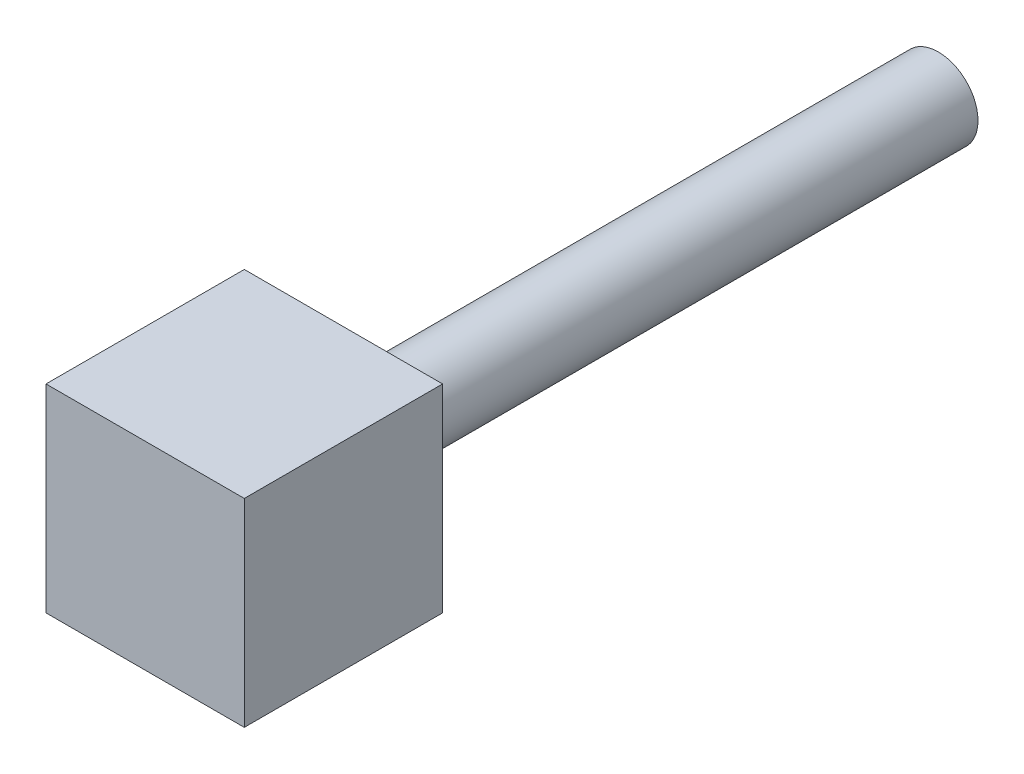
ISO-10303-21;
HEADER;
FILE_DESCRIPTION(('STEP AP214'),'2;1');
FILE_NAME('part.step','',(''),(''),'','','');
FILE_SCHEMA(('AUTOMOTIVE_DESIGN { 1 0 10303 214 1 1 1 1 }'));
ENDSEC;
DATA;
#1=APPLICATION_CONTEXT('core data for automotive mechanical design processes');
#2=APPLICATION_PROTOCOL_DEFINITION('international standard','automotive_design',2000,#1);
#3=PRODUCT_CONTEXT('',#1,'mechanical');
#4=PRODUCT('Part','Part','',(#3));
#5=PRODUCT_RELATED_PRODUCT_CATEGORY('part','',(#4));
#6=PRODUCT_DEFINITION_FORMATION('','',#4);
#7=PRODUCT_DEFINITION_CONTEXT('part definition',#1,'design');
#8=PRODUCT_DEFINITION('design','',#6,#7);
#9=PRODUCT_DEFINITION_SHAPE('','',#8);
#10=(LENGTH_UNIT() NAMED_UNIT(*) SI_UNIT(.MILLI.,.METRE.));
#11=(NAMED_UNIT(*) PLANE_ANGLE_UNIT() SI_UNIT($,.RADIAN.));
#12=(NAMED_UNIT(*) SI_UNIT($,.STERADIAN.) SOLID_ANGLE_UNIT());
#13=UNCERTAINTY_MEASURE_WITH_UNIT(LENGTH_MEASURE(1.E-05),#10,'distance_accuracy_value','');
#14=(GEOMETRIC_REPRESENTATION_CONTEXT(3) GLOBAL_UNCERTAINTY_ASSIGNED_CONTEXT((#13)) GLOBAL_UNIT_ASSIGNED_CONTEXT((#10,
#11,#12)) REPRESENTATION_CONTEXT('',''));
#15=CARTESIAN_POINT('',(0.,0.,0.));
#16=DIRECTION('',(0.,0.,1.));
#17=DIRECTION('',(1.,0.,0.));
#18=AXIS2_PLACEMENT_3D('',#15,#16,#17);
#19=CARTESIAN_POINT('',(0.,1.19607843137255,-14.78460404663));
#20=DIRECTION('',(0.,0.,1.));
#21=DIRECTION('',(1.,0.,0.));
#22=AXIS2_PLACEMENT_3D('',#19,#20,#21);
#23=PLANE('',#22);
#24=CARTESIAN_POINT('',(0.,1.19607843137255,-14.78460404663));
#25=DIRECTION('',(0.,0.,1.));
#26=DIRECTION('',(1.,0.,0.));
#27=AXIS2_PLACEMENT_3D('',#24,#25,#26);
#28=CIRCLE('',#27,4.);
#29=CARTESIAN_POINT('',(4.,1.19607843137255,-14.78460404663));
#30=VERTEX_POINT('',#29);
#31=EDGE_CURVE('E47',#30,#30,#28,.T.);
#32=ORIENTED_EDGE('',*,*,#31,.F.);
#33=EDGE_LOOP('',(#32));
#34=FACE_BOUND('',#33,.T.);
#35=ADVANCED_FACE('F39',(#34),#23,.F.);
#36=CARTESIAN_POINT('',(0.,1.19607843137255,45.21539595337));
#37=DIRECTION('',(0.,0.,1.));
#38=DIRECTION('',(1.,0.,0.));
#39=AXIS2_PLACEMENT_3D('',#36,#37,#38);
#40=CYLINDRICAL_SURFACE('',#39,4.);
#41=CARTESIAN_POINT('',(0.,1.19607843137255,45.21539595337));
#42=DIRECTION('',(0.,0.,1.));
#43=DIRECTION('',(1.,0.,0.));
#44=AXIS2_PLACEMENT_3D('',#41,#42,#43);
#45=CIRCLE('',#44,4.);
#46=CARTESIAN_POINT('',(4.,1.19607843137255,45.21539595337));
#47=VERTEX_POINT('',#46);
#48=EDGE_CURVE('E11',#47,#47,#45,.T.);
#49=ORIENTED_EDGE('',*,*,#48,.F.);
#50=EDGE_LOOP('',(#49));
#51=FACE_BOUND('',#50,.T.);
#52=ORIENTED_EDGE('',*,*,#31,.T.);
#53=EDGE_LOOP('',(#52));
#54=FACE_BOUND('',#53,.T.);
#55=ADVANCED_FACE('F117',(#51,#54),#40,.T.);
#56=CARTESIAN_POINT('',(10.,-8.80392156862745,65.21539595337));
#57=DIRECTION('',(-1.,0.,0.));
#58=DIRECTION('',(0.,-1.,0.));
#59=AXIS2_PLACEMENT_3D('',#56,#57,#58);
#60=PLANE('',#59);
#61=DIRECTION('',(0.,1.,0.));
#62=VECTOR('',#61,1.);
#63=CARTESIAN_POINT('',(10.,-8.80392156862745,45.21539595337));
#64=LINE('',#63,#62);
#65=CARTESIAN_POINT('',(10.,-8.80392156862745,45.21539595337));
#66=VERTEX_POINT('',#65);
#67=CARTESIAN_POINT('',(10.,11.1960784313726,45.21539595337));
#68=VERTEX_POINT('',#67);
#69=EDGE_CURVE('E106',#66,#68,#64,.T.);
#70=ORIENTED_EDGE('',*,*,#69,.T.);
#71=DIRECTION('',(0.,0.,-1.));
#72=VECTOR('',#71,1.);
#73=CARTESIAN_POINT('',(10.,11.1960784313726,65.21539595337));
#74=LINE('',#73,#72);
#75=CARTESIAN_POINT('',(10.,11.1960784313726,65.21539595337));
#76=VERTEX_POINT('',#75);
#77=EDGE_CURVE('E97',#76,#68,#74,.T.);
#78=ORIENTED_EDGE('',*,*,#77,.F.);
#79=DIRECTION('',(0.,1.,0.));
#80=VECTOR('',#79,1.);
#81=CARTESIAN_POINT('',(10.,-8.80392156862745,65.21539595337));
#82=LINE('',#81,#80);
#83=CARTESIAN_POINT('',(10.,-8.80392156862745,65.21539595337));
#84=VERTEX_POINT('',#83);
#85=EDGE_CURVE('E91',#84,#76,#82,.T.);
#86=ORIENTED_EDGE('',*,*,#85,.F.);
#87=DIRECTION('',(0.,0.,-1.));
#88=VECTOR('',#87,1.);
#89=CARTESIAN_POINT('',(10.,-8.80392156862745,65.21539595337));
#90=LINE('',#89,#88);
#91=EDGE_CURVE('E102',#84,#66,#90,.T.);
#92=ORIENTED_EDGE('',*,*,#91,.T.);
#93=EDGE_LOOP('',(#70,#78,#86,#92));
#94=FACE_BOUND('',#93,.T.);
#95=ADVANCED_FACE('F123',(#94),#60,.F.);
#96=CARTESIAN_POINT('',(-10.,11.1960784313726,65.21539595337));
#97=DIRECTION('',(0.,-1.,0.));
#98=DIRECTION('',(0.,0.,-1.));
#99=AXIS2_PLACEMENT_3D('',#96,#97,#98);
#100=PLANE('',#99);
#101=DIRECTION('',(-1.,0.,0.));
#102=VECTOR('',#101,1.);
#103=CARTESIAN_POINT('',(-10.,11.1960784313726,45.21539595337));
#104=LINE('',#103,#102);
#105=CARTESIAN_POINT('',(-10.,11.1960784313726,45.21539595337));
#106=VERTEX_POINT('',#105);
#107=EDGE_CURVE('E96',#68,#106,#104,.T.);
#108=ORIENTED_EDGE('',*,*,#107,.T.);
#109=DIRECTION('',(0.,0.,-1.));
#110=VECTOR('',#109,1.);
#111=CARTESIAN_POINT('',(-10.,11.1960784313726,65.21539595337));
#112=LINE('',#111,#110);
#113=CARTESIAN_POINT('',(-10.,11.1960784313726,65.21539595337));
#114=VERTEX_POINT('',#113);
#115=EDGE_CURVE('E94',#114,#106,#112,.T.);
#116=ORIENTED_EDGE('',*,*,#115,.F.);
#117=DIRECTION('',(-1.,0.,0.));
#118=VECTOR('',#117,1.);
#119=CARTESIAN_POINT('',(-10.,11.1960784313726,65.21539595337));
#120=LINE('',#119,#118);
#121=EDGE_CURVE('E86',#76,#114,#120,.T.);
#122=ORIENTED_EDGE('',*,*,#121,.F.);
#123=ORIENTED_EDGE('',*,*,#77,.T.);
#124=EDGE_LOOP('',(#108,#116,#122,#123));
#125=FACE_BOUND('',#124,.T.);
#126=ADVANCED_FACE('F95',(#125),#100,.F.);
#127=CARTESIAN_POINT('',(-10.,-8.80392156862745,65.21539595337));
#128=DIRECTION('',(1.,0.,0.));
#129=DIRECTION('',(0.,1.,0.));
#130=AXIS2_PLACEMENT_3D('',#127,#128,#129);
#131=PLANE('',#130);
#132=DIRECTION('',(0.,-1.,0.));
#133=VECTOR('',#132,1.);
#134=CARTESIAN_POINT('',(-10.,-8.80392156862745,45.21539595337));
#135=LINE('',#134,#133);
#136=CARTESIAN_POINT('',(-10.,-8.80392156862745,45.21539595337));
#137=VERTEX_POINT('',#136);
#138=EDGE_CURVE('E72',#106,#137,#135,.T.);
#139=ORIENTED_EDGE('',*,*,#138,.T.);
#140=DIRECTION('',(0.,0.,-1.));
#141=VECTOR('',#140,1.);
#142=CARTESIAN_POINT('',(-10.,-8.80392156862745,65.21539595337));
#143=LINE('',#142,#141);
#144=CARTESIAN_POINT('',(-10.,-8.80392156862745,65.21539595337));
#145=VERTEX_POINT('',#144);
#146=EDGE_CURVE('E98',#145,#137,#143,.T.);
#147=ORIENTED_EDGE('',*,*,#146,.F.);
#148=DIRECTION('',(0.,-1.,0.));
#149=VECTOR('',#148,1.);
#150=CARTESIAN_POINT('',(-10.,-8.80392156862745,65.21539595337));
#151=LINE('',#150,#149);
#152=EDGE_CURVE('E89',#114,#145,#151,.T.);
#153=ORIENTED_EDGE('',*,*,#152,.F.);
#154=ORIENTED_EDGE('',*,*,#115,.T.);
#155=EDGE_LOOP('',(#139,#147,#153,#154));
#156=FACE_BOUND('',#155,.T.);
#157=ADVANCED_FACE('F100',(#156),#131,.F.);
#158=CARTESIAN_POINT('',(-10.,-8.80392156862745,65.21539595337));
#159=DIRECTION('',(0.,1.,0.));
#160=DIRECTION('',(0.,0.,1.));
#161=AXIS2_PLACEMENT_3D('',#158,#159,#160);
#162=PLANE('',#161);
#163=DIRECTION('',(1.,0.,0.));
#164=VECTOR('',#163,1.);
#165=CARTESIAN_POINT('',(-10.,-8.80392156862745,45.21539595337));
#166=LINE('',#165,#164);
#167=EDGE_CURVE('E78',#137,#66,#166,.T.);
#168=ORIENTED_EDGE('',*,*,#167,.T.);
#169=ORIENTED_EDGE('',*,*,#91,.F.);
#170=DIRECTION('',(1.,0.,0.));
#171=VECTOR('',#170,1.);
#172=CARTESIAN_POINT('',(-10.,-8.80392156862745,65.21539595337));
#173=LINE('',#172,#171);
#174=EDGE_CURVE('E55',#145,#84,#173,.T.);
#175=ORIENTED_EDGE('',*,*,#174,.F.);
#176=ORIENTED_EDGE('',*,*,#146,.T.);
#177=EDGE_LOOP('',(#168,#169,#175,#176));
#178=FACE_BOUND('',#177,.T.);
#179=ADVANCED_FACE('F136',(#178),#162,.F.);
#180=CARTESIAN_POINT('',(0.,0.,65.21539595337));
#181=DIRECTION('',(0.,0.,-1.));
#182=DIRECTION('',(-1.,0.,0.));
#183=AXIS2_PLACEMENT_3D('',#180,#181,#182);
#184=PLANE('',#183);
#185=ORIENTED_EDGE('',*,*,#85,.T.);
#186=ORIENTED_EDGE('',*,*,#121,.T.);
#187=ORIENTED_EDGE('',*,*,#152,.T.);
#188=ORIENTED_EDGE('',*,*,#174,.T.);
#189=EDGE_LOOP('',(#185,#186,#187,#188));
#190=FACE_BOUND('',#189,.T.);
#191=ADVANCED_FACE('F87',(#190),#184,.F.);
#192=CARTESIAN_POINT('',(0.,0.,45.21539595337));
#193=DIRECTION('',(0.,0.,-1.));
#194=DIRECTION('',(-1.,0.,0.));
#195=AXIS2_PLACEMENT_3D('',#192,#193,#194);
#196=PLANE('',#195);
#197=ORIENTED_EDGE('',*,*,#48,.T.);
#198=EDGE_LOOP('',(#197));
#199=FACE_BOUND('',#198,.T.);
#200=ORIENTED_EDGE('',*,*,#69,.F.);
#201=ORIENTED_EDGE('',*,*,#167,.F.);
#202=ORIENTED_EDGE('',*,*,#138,.F.);
#203=ORIENTED_EDGE('',*,*,#107,.F.);
#204=EDGE_LOOP('',(#200,#201,#202,#203));
#205=FACE_BOUND('',#204,.T.);
#206=ADVANCED_FACE('F139',(#199,#205),#196,.T.);
#207=CLOSED_SHELL('',(#35,#55,#95,#126,#157,#179,#191,#206));
#208=MANIFOLD_SOLID_BREP('B2',#207);
#209=ADVANCED_BREP_SHAPE_REPRESENTATION('',(#18,#208),#14);
#210=SHAPE_DEFINITION_REPRESENTATION(#9,#209);
ENDSEC;
END-ISO-10303-21;
